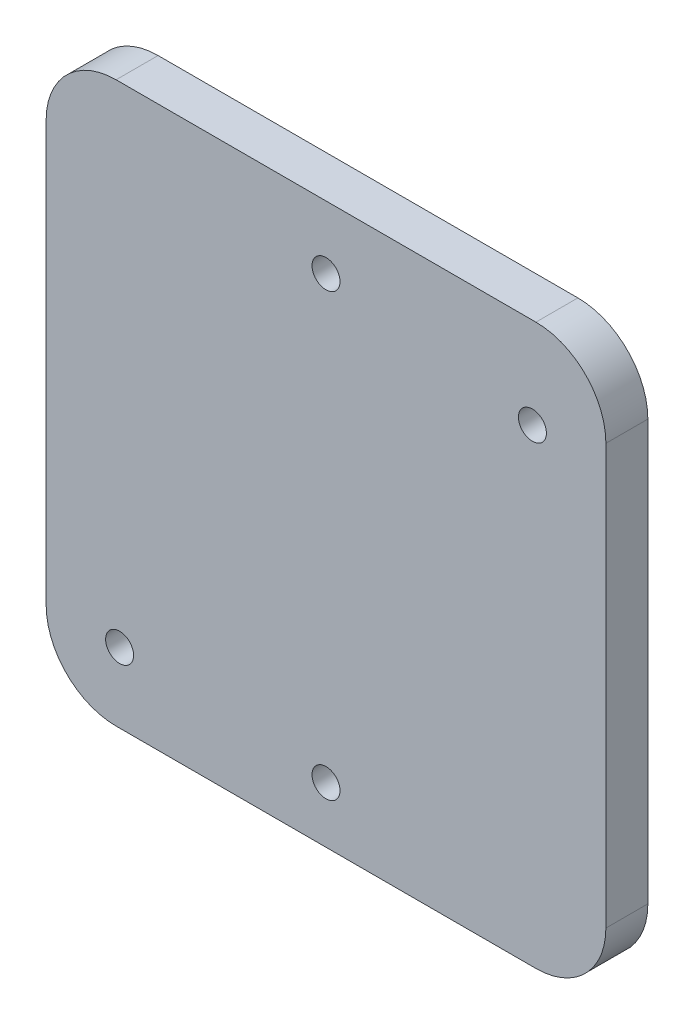
ISO-10303-21;
HEADER;
FILE_DESCRIPTION(('STEP AP214'),'2;1');
FILE_NAME('part.step','',(''),(''),'','','');
FILE_SCHEMA(('AUTOMOTIVE_DESIGN { 1 0 10303 214 1 1 1 1 }'));
ENDSEC;
DATA;
#1=APPLICATION_CONTEXT('core data for automotive mechanical design processes');
#2=APPLICATION_PROTOCOL_DEFINITION('international standard','automotive_design',2000,#1);
#3=PRODUCT_CONTEXT('',#1,'mechanical');
#4=PRODUCT('Part','Part','',(#3));
#5=PRODUCT_RELATED_PRODUCT_CATEGORY('part','',(#4));
#6=PRODUCT_DEFINITION_FORMATION('','',#4);
#7=PRODUCT_DEFINITION_CONTEXT('part definition',#1,'design');
#8=PRODUCT_DEFINITION('design','',#6,#7);
#9=PRODUCT_DEFINITION_SHAPE('','',#8);
#10=(LENGTH_UNIT() NAMED_UNIT(*) SI_UNIT(.MILLI.,.METRE.));
#11=(NAMED_UNIT(*) PLANE_ANGLE_UNIT() SI_UNIT($,.RADIAN.));
#12=(NAMED_UNIT(*) SI_UNIT($,.STERADIAN.) SOLID_ANGLE_UNIT());
#13=UNCERTAINTY_MEASURE_WITH_UNIT(LENGTH_MEASURE(1.E-05),#10,'distance_accuracy_value','');
#14=(GEOMETRIC_REPRESENTATION_CONTEXT(3) GLOBAL_UNCERTAINTY_ASSIGNED_CONTEXT((#13)) GLOBAL_UNIT_ASSIGNED_CONTEXT((#10,
#11,#12)) REPRESENTATION_CONTEXT('',''));
#15=CARTESIAN_POINT('',(0.,0.,0.));
#16=DIRECTION('',(0.,0.,1.));
#17=DIRECTION('',(1.,0.,0.));
#18=AXIS2_PLACEMENT_3D('',#15,#16,#17);
#19=CARTESIAN_POINT('',(-30.,30.,6.));
#20=DIRECTION('',(0.,0.,-1.));
#21=DIRECTION('',(-1.,0.,0.));
#22=AXIS2_PLACEMENT_3D('',#19,#20,#21);
#23=CYLINDRICAL_SURFACE('',#22,10.);
#24=CARTESIAN_POINT('',(-30.,30.,0.));
#25=DIRECTION('',(0.,0.,1.));
#26=DIRECTION('',(1.,0.,0.));
#27=AXIS2_PLACEMENT_3D('',#24,#25,#26);
#28=CIRCLE('',#27,10.);
#29=CARTESIAN_POINT('',(-30.,40.,0.));
#30=VERTEX_POINT('',#29);
#31=CARTESIAN_POINT('',(-40.,30.,0.));
#32=VERTEX_POINT('',#31);
#33=EDGE_CURVE('E129',#30,#32,#28,.T.);
#34=ORIENTED_EDGE('',*,*,#33,.T.);
#35=DIRECTION('',(0.,0.,-1.));
#36=VECTOR('',#35,1.);
#37=CARTESIAN_POINT('',(-40.,30.,6.));
#38=LINE('',#37,#36);
#39=CARTESIAN_POINT('',(-40.,30.,6.));
#40=VERTEX_POINT('',#39);
#41=EDGE_CURVE('E11',#40,#32,#38,.T.);
#42=ORIENTED_EDGE('',*,*,#41,.F.);
#43=CARTESIAN_POINT('',(-30.,30.,6.));
#44=DIRECTION('',(0.,0.,1.));
#45=DIRECTION('',(1.,0.,0.));
#46=AXIS2_PLACEMENT_3D('',#43,#44,#45);
#47=CIRCLE('',#46,10.);
#48=CARTESIAN_POINT('',(-30.,40.,6.));
#49=VERTEX_POINT('',#48);
#50=EDGE_CURVE('E144',#49,#40,#47,.T.);
#51=ORIENTED_EDGE('',*,*,#50,.F.);
#52=DIRECTION('',(0.,0.,-1.));
#53=VECTOR('',#52,1.);
#54=CARTESIAN_POINT('',(-30.,40.,6.));
#55=LINE('',#54,#53);
#56=EDGE_CURVE('E125',#49,#30,#55,.T.);
#57=ORIENTED_EDGE('',*,*,#56,.T.);
#58=EDGE_LOOP('',(#34,#42,#51,#57));
#59=FACE_BOUND('',#58,.T.);
#60=ADVANCED_FACE('F33',(#59),#23,.T.);
#61=CARTESIAN_POINT('',(-40.,30.,6.));
#62=DIRECTION('',(1.,0.,0.));
#63=DIRECTION('',(0.,0.,-1.));
#64=AXIS2_PLACEMENT_3D('',#61,#62,#63);
#65=PLANE('',#64);
#66=DIRECTION('',(0.,-1.,0.));
#67=VECTOR('',#66,1.);
#68=CARTESIAN_POINT('',(-40.,30.,0.));
#69=LINE('',#68,#67);
#70=CARTESIAN_POINT('',(-40.,-30.,0.));
#71=VERTEX_POINT('',#70);
#72=EDGE_CURVE('E132',#32,#71,#69,.T.);
#73=ORIENTED_EDGE('',*,*,#72,.T.);
#74=DIRECTION('',(0.,0.,-1.));
#75=VECTOR('',#74,1.);
#76=CARTESIAN_POINT('',(-40.,-30.,6.));
#77=LINE('',#76,#75);
#78=CARTESIAN_POINT('',(-40.,-30.,6.));
#79=VERTEX_POINT('',#78);
#80=EDGE_CURVE('E41',#79,#71,#77,.T.);
#81=ORIENTED_EDGE('',*,*,#80,.F.);
#82=DIRECTION('',(0.,-1.,0.));
#83=VECTOR('',#82,1.);
#84=CARTESIAN_POINT('',(-40.,30.,6.));
#85=LINE('',#84,#83);
#86=EDGE_CURVE('E92',#40,#79,#85,.T.);
#87=ORIENTED_EDGE('',*,*,#86,.F.);
#88=ORIENTED_EDGE('',*,*,#41,.T.);
#89=EDGE_LOOP('',(#73,#81,#87,#88));
#90=FACE_BOUND('',#89,.T.);
#91=ADVANCED_FACE('F234',(#90),#65,.F.);
#92=CARTESIAN_POINT('',(-30.,-30.,6.));
#93=DIRECTION('',(0.,0.,-1.));
#94=DIRECTION('',(-1.,0.,0.));
#95=AXIS2_PLACEMENT_3D('',#92,#93,#94);
#96=CYLINDRICAL_SURFACE('',#95,10.);
#97=CARTESIAN_POINT('',(-30.,-30.,0.));
#98=DIRECTION('',(0.,0.,1.));
#99=DIRECTION('',(-1.,0.,0.));
#100=AXIS2_PLACEMENT_3D('',#97,#98,#99);
#101=CIRCLE('',#100,10.);
#102=CARTESIAN_POINT('',(-30.,-40.,0.));
#103=VERTEX_POINT('',#102);
#104=EDGE_CURVE('E135',#71,#103,#101,.T.);
#105=ORIENTED_EDGE('',*,*,#104,.T.);
#106=DIRECTION('',(0.,0.,-1.));
#107=VECTOR('',#106,1.);
#108=CARTESIAN_POINT('',(-30.,-40.,6.));
#109=LINE('',#108,#107);
#110=CARTESIAN_POINT('',(-30.,-40.,6.));
#111=VERTEX_POINT('',#110);
#112=EDGE_CURVE('E151',#111,#103,#109,.T.);
#113=ORIENTED_EDGE('',*,*,#112,.F.);
#114=CARTESIAN_POINT('',(-30.,-30.,6.));
#115=DIRECTION('',(0.,0.,1.));
#116=DIRECTION('',(-1.,0.,0.));
#117=AXIS2_PLACEMENT_3D('',#114,#115,#116);
#118=CIRCLE('',#117,10.);
#119=EDGE_CURVE('E159',#79,#111,#118,.T.);
#120=ORIENTED_EDGE('',*,*,#119,.F.);
#121=ORIENTED_EDGE('',*,*,#80,.T.);
#122=EDGE_LOOP('',(#105,#113,#120,#121));
#123=FACE_BOUND('',#122,.T.);
#124=ADVANCED_FACE('F157',(#123),#96,.T.);
#125=CARTESIAN_POINT('',(-30.,-40.,6.));
#126=DIRECTION('',(0.,1.,0.));
#127=DIRECTION('',(-1.,0.,0.));
#128=AXIS2_PLACEMENT_3D('',#125,#126,#127);
#129=PLANE('',#128);
#130=DIRECTION('',(1.,0.,0.));
#131=VECTOR('',#130,1.);
#132=CARTESIAN_POINT('',(-30.,-40.,0.));
#133=LINE('',#132,#131);
#134=CARTESIAN_POINT('',(30.,-40.,0.));
#135=VERTEX_POINT('',#134);
#136=EDGE_CURVE('E137',#103,#135,#133,.T.);
#137=ORIENTED_EDGE('',*,*,#136,.T.);
#138=DIRECTION('',(0.,0.,-1.));
#139=VECTOR('',#138,1.);
#140=CARTESIAN_POINT('',(30.,-40.,6.));
#141=LINE('',#140,#139);
#142=CARTESIAN_POINT('',(30.,-40.,6.));
#143=VERTEX_POINT('',#142);
#144=EDGE_CURVE('E148',#143,#135,#141,.T.);
#145=ORIENTED_EDGE('',*,*,#144,.F.);
#146=DIRECTION('',(1.,0.,0.));
#147=VECTOR('',#146,1.);
#148=CARTESIAN_POINT('',(-30.,-40.,6.));
#149=LINE('',#148,#147);
#150=EDGE_CURVE('E171',#111,#143,#149,.T.);
#151=ORIENTED_EDGE('',*,*,#150,.F.);
#152=ORIENTED_EDGE('',*,*,#112,.T.);
#153=EDGE_LOOP('',(#137,#145,#151,#152));
#154=FACE_BOUND('',#153,.T.);
#155=ADVANCED_FACE('F167',(#154),#129,.F.);
#156=CARTESIAN_POINT('',(30.,-30.,6.));
#157=DIRECTION('',(0.,0.,-1.));
#158=DIRECTION('',(-1.,0.,0.));
#159=AXIS2_PLACEMENT_3D('',#156,#157,#158);
#160=CYLINDRICAL_SURFACE('',#159,10.);
#161=CARTESIAN_POINT('',(30.,-30.,0.));
#162=DIRECTION('',(0.,0.,1.));
#163=DIRECTION('',(1.,0.,0.));
#164=AXIS2_PLACEMENT_3D('',#161,#162,#163);
#165=CIRCLE('',#164,10.);
#166=CARTESIAN_POINT('',(40.,-30.,0.));
#167=VERTEX_POINT('',#166);
#168=EDGE_CURVE('E139',#135,#167,#165,.T.);
#169=ORIENTED_EDGE('',*,*,#168,.T.);
#170=DIRECTION('',(0.,0.,-1.));
#171=VECTOR('',#170,1.);
#172=CARTESIAN_POINT('',(40.,-30.,6.));
#173=LINE('',#172,#171);
#174=CARTESIAN_POINT('',(40.,-30.,6.));
#175=VERTEX_POINT('',#174);
#176=EDGE_CURVE('E120',#175,#167,#173,.T.);
#177=ORIENTED_EDGE('',*,*,#176,.F.);
#178=CARTESIAN_POINT('',(30.,-30.,6.));
#179=DIRECTION('',(0.,0.,1.));
#180=DIRECTION('',(1.,0.,0.));
#181=AXIS2_PLACEMENT_3D('',#178,#179,#180);
#182=CIRCLE('',#181,10.);
#183=EDGE_CURVE('E111',#143,#175,#182,.T.);
#184=ORIENTED_EDGE('',*,*,#183,.F.);
#185=ORIENTED_EDGE('',*,*,#144,.T.);
#186=EDGE_LOOP('',(#169,#177,#184,#185));
#187=FACE_BOUND('',#186,.T.);
#188=ADVANCED_FACE('F170',(#187),#160,.T.);
#189=CARTESIAN_POINT('',(40.,30.,6.));
#190=DIRECTION('',(-1.,0.,0.));
#191=DIRECTION('',(0.,-1.,0.));
#192=AXIS2_PLACEMENT_3D('',#189,#190,#191);
#193=PLANE('',#192);
#194=DIRECTION('',(0.,1.,0.));
#195=VECTOR('',#194,1.);
#196=CARTESIAN_POINT('',(40.,30.,0.));
#197=LINE('',#196,#195);
#198=CARTESIAN_POINT('',(40.,30.,0.));
#199=VERTEX_POINT('',#198);
#200=EDGE_CURVE('E119',#167,#199,#197,.T.);
#201=ORIENTED_EDGE('',*,*,#200,.T.);
#202=DIRECTION('',(0.,0.,-1.));
#203=VECTOR('',#202,1.);
#204=CARTESIAN_POINT('',(40.,30.,6.));
#205=LINE('',#204,#203);
#206=CARTESIAN_POINT('',(40.,30.,6.));
#207=VERTEX_POINT('',#206);
#208=EDGE_CURVE('E116',#207,#199,#205,.T.);
#209=ORIENTED_EDGE('',*,*,#208,.F.);
#210=DIRECTION('',(0.,1.,0.));
#211=VECTOR('',#210,1.);
#212=CARTESIAN_POINT('',(40.,30.,6.));
#213=LINE('',#212,#211);
#214=EDGE_CURVE('E105',#175,#207,#213,.T.);
#215=ORIENTED_EDGE('',*,*,#214,.F.);
#216=ORIENTED_EDGE('',*,*,#176,.T.);
#217=EDGE_LOOP('',(#201,#209,#215,#216));
#218=FACE_BOUND('',#217,.T.);
#219=ADVANCED_FACE('F117',(#218),#193,.F.);
#220=CARTESIAN_POINT('',(30.,30.,6.));
#221=DIRECTION('',(0.,0.,-1.));
#222=DIRECTION('',(-1.,0.,0.));
#223=AXIS2_PLACEMENT_3D('',#220,#221,#222);
#224=CYLINDRICAL_SURFACE('',#223,10.);
#225=CARTESIAN_POINT('',(30.,30.,0.));
#226=DIRECTION('',(0.,0.,1.));
#227=DIRECTION('',(-1.,0.,0.));
#228=AXIS2_PLACEMENT_3D('',#225,#226,#227);
#229=CIRCLE('',#228,10.);
#230=CARTESIAN_POINT('',(30.,40.,0.));
#231=VERTEX_POINT('',#230);
#232=EDGE_CURVE('E78',#199,#231,#229,.T.);
#233=ORIENTED_EDGE('',*,*,#232,.T.);
#234=DIRECTION('',(0.,0.,-1.));
#235=VECTOR('',#234,1.);
#236=CARTESIAN_POINT('',(30.,40.,6.));
#237=LINE('',#236,#235);
#238=CARTESIAN_POINT('',(30.,40.,6.));
#239=VERTEX_POINT('',#238);
#240=EDGE_CURVE('E121',#239,#231,#237,.T.);
#241=ORIENTED_EDGE('',*,*,#240,.F.);
#242=CARTESIAN_POINT('',(30.,30.,6.));
#243=DIRECTION('',(0.,0.,1.));
#244=DIRECTION('',(-1.,0.,0.));
#245=AXIS2_PLACEMENT_3D('',#242,#243,#244);
#246=CIRCLE('',#245,10.);
#247=EDGE_CURVE('E109',#207,#239,#246,.T.);
#248=ORIENTED_EDGE('',*,*,#247,.F.);
#249=ORIENTED_EDGE('',*,*,#208,.T.);
#250=EDGE_LOOP('',(#233,#241,#248,#249));
#251=FACE_BOUND('',#250,.T.);
#252=ADVANCED_FACE('F123',(#251),#224,.T.);
#253=CARTESIAN_POINT('',(-30.,40.,6.));
#254=DIRECTION('',(0.,-1.,0.));
#255=DIRECTION('',(0.,0.,-1.));
#256=AXIS2_PLACEMENT_3D('',#253,#254,#255);
#257=PLANE('',#256);
#258=DIRECTION('',(-1.,0.,0.));
#259=VECTOR('',#258,1.);
#260=CARTESIAN_POINT('',(-30.,40.,0.));
#261=LINE('',#260,#259);
#262=EDGE_CURVE('E84',#231,#30,#261,.T.);
#263=ORIENTED_EDGE('',*,*,#262,.T.);
#264=ORIENTED_EDGE('',*,*,#56,.F.);
#265=DIRECTION('',(-1.,0.,0.));
#266=VECTOR('',#265,1.);
#267=CARTESIAN_POINT('',(-30.,40.,6.));
#268=LINE('',#267,#266);
#269=EDGE_CURVE('E49',#239,#49,#268,.T.);
#270=ORIENTED_EDGE('',*,*,#269,.F.);
#271=ORIENTED_EDGE('',*,*,#240,.T.);
#272=EDGE_LOOP('',(#263,#264,#270,#271));
#273=FACE_BOUND('',#272,.T.);
#274=ADVANCED_FACE('F212',(#273),#257,.F.);
#275=CARTESIAN_POINT('',(-30.,30.,6.));
#276=DIRECTION('',(0.,0.,1.));
#277=DIRECTION('',(1.,0.,0.));
#278=AXIS2_PLACEMENT_3D('',#275,#276,#277);
#279=PLANE('',#278);
#280=CARTESIAN_POINT('',(-29.5,-30.,6.));
#281=DIRECTION('',(0.,0.,1.));
#282=DIRECTION('',(1.,0.,0.));
#283=AXIS2_PLACEMENT_3D('',#280,#281,#282);
#284=CIRCLE('',#283,2.);
#285=CARTESIAN_POINT('',(-27.5,-30.,6.));
#286=VERTEX_POINT('',#285);
#287=EDGE_CURVE('E195',#286,#286,#284,.T.);
#288=ORIENTED_EDGE('',*,*,#287,.F.);
#289=EDGE_LOOP('',(#288));
#290=FACE_BOUND('',#289,.T.);
#291=CARTESIAN_POINT('',(0.,-32.,6.));
#292=DIRECTION('',(0.,0.,1.));
#293=DIRECTION('',(1.,0.,0.));
#294=AXIS2_PLACEMENT_3D('',#291,#292,#293);
#295=CIRCLE('',#294,2.);
#296=CARTESIAN_POINT('',(2.,-32.,6.));
#297=VERTEX_POINT('',#296);
#298=EDGE_CURVE('E189',#297,#297,#295,.T.);
#299=ORIENTED_EDGE('',*,*,#298,.F.);
#300=EDGE_LOOP('',(#299));
#301=FACE_BOUND('',#300,.T.);
#302=CARTESIAN_POINT('',(29.5,27.,6.));
#303=DIRECTION('',(0.,0.,1.));
#304=DIRECTION('',(1.,0.,0.));
#305=AXIS2_PLACEMENT_3D('',#302,#303,#304);
#306=CIRCLE('',#305,2.);
#307=CARTESIAN_POINT('',(31.5,27.,6.));
#308=VERTEX_POINT('',#307);
#309=EDGE_CURVE('E183',#308,#308,#306,.T.);
#310=ORIENTED_EDGE('',*,*,#309,.F.);
#311=EDGE_LOOP('',(#310));
#312=FACE_BOUND('',#311,.T.);
#313=CARTESIAN_POINT('',(0.,31.,6.));
#314=DIRECTION('',(0.,0.,1.));
#315=DIRECTION('',(1.,0.,0.));
#316=AXIS2_PLACEMENT_3D('',#313,#314,#315);
#317=CIRCLE('',#316,2.);
#318=CARTESIAN_POINT('',(2.,31.,6.));
#319=VERTEX_POINT('',#318);
#320=EDGE_CURVE('E177',#319,#319,#317,.T.);
#321=ORIENTED_EDGE('',*,*,#320,.F.);
#322=EDGE_LOOP('',(#321));
#323=FACE_BOUND('',#322,.T.);
#324=ORIENTED_EDGE('',*,*,#50,.T.);
#325=ORIENTED_EDGE('',*,*,#86,.T.);
#326=ORIENTED_EDGE('',*,*,#119,.T.);
#327=ORIENTED_EDGE('',*,*,#150,.T.);
#328=ORIENTED_EDGE('',*,*,#183,.T.);
#329=ORIENTED_EDGE('',*,*,#214,.T.);
#330=ORIENTED_EDGE('',*,*,#247,.T.);
#331=ORIENTED_EDGE('',*,*,#269,.T.);
#332=EDGE_LOOP('',(#324,#325,#326,#327,#328,#329,#330,#331));
#333=FACE_BOUND('',#332,.T.);
#334=ADVANCED_FACE('F107',(#290,#301,#312,#323,#333),#279,.T.);
#335=CARTESIAN_POINT('',(-30.,30.,0.));
#336=DIRECTION('',(0.,0.,1.));
#337=DIRECTION('',(1.,0.,0.));
#338=AXIS2_PLACEMENT_3D('',#335,#336,#337);
#339=PLANE('',#338);
#340=CARTESIAN_POINT('',(-29.5,-30.,0.));
#341=DIRECTION('',(0.,0.,1.));
#342=DIRECTION('',(1.,0.,0.));
#343=AXIS2_PLACEMENT_3D('',#340,#341,#342);
#344=CIRCLE('',#343,2.);
#345=CARTESIAN_POINT('',(-27.5,-30.,0.));
#346=VERTEX_POINT('',#345);
#347=EDGE_CURVE('E192',#346,#346,#344,.T.);
#348=ORIENTED_EDGE('',*,*,#347,.T.);
#349=EDGE_LOOP('',(#348));
#350=FACE_BOUND('',#349,.T.);
#351=CARTESIAN_POINT('',(0.,-32.,0.));
#352=DIRECTION('',(0.,0.,1.));
#353=DIRECTION('',(1.,0.,0.));
#354=AXIS2_PLACEMENT_3D('',#351,#352,#353);
#355=CIRCLE('',#354,2.);
#356=CARTESIAN_POINT('',(2.,-32.,0.));
#357=VERTEX_POINT('',#356);
#358=EDGE_CURVE('E186',#357,#357,#355,.T.);
#359=ORIENTED_EDGE('',*,*,#358,.T.);
#360=EDGE_LOOP('',(#359));
#361=FACE_BOUND('',#360,.T.);
#362=CARTESIAN_POINT('',(29.5,27.,0.));
#363=DIRECTION('',(0.,0.,1.));
#364=DIRECTION('',(1.,0.,0.));
#365=AXIS2_PLACEMENT_3D('',#362,#363,#364);
#366=CIRCLE('',#365,2.);
#367=CARTESIAN_POINT('',(31.5,27.,0.));
#368=VERTEX_POINT('',#367);
#369=EDGE_CURVE('E180',#368,#368,#366,.T.);
#370=ORIENTED_EDGE('',*,*,#369,.T.);
#371=EDGE_LOOP('',(#370));
#372=FACE_BOUND('',#371,.T.);
#373=CARTESIAN_POINT('',(0.,31.,0.));
#374=DIRECTION('',(0.,0.,1.));
#375=DIRECTION('',(1.,0.,0.));
#376=AXIS2_PLACEMENT_3D('',#373,#374,#375);
#377=CIRCLE('',#376,2.);
#378=CARTESIAN_POINT('',(2.,31.,0.));
#379=VERTEX_POINT('',#378);
#380=EDGE_CURVE('E133',#379,#379,#377,.T.);
#381=ORIENTED_EDGE('',*,*,#380,.T.);
#382=EDGE_LOOP('',(#381));
#383=FACE_BOUND('',#382,.T.);
#384=ORIENTED_EDGE('',*,*,#33,.F.);
#385=ORIENTED_EDGE('',*,*,#262,.F.);
#386=ORIENTED_EDGE('',*,*,#232,.F.);
#387=ORIENTED_EDGE('',*,*,#200,.F.);
#388=ORIENTED_EDGE('',*,*,#168,.F.);
#389=ORIENTED_EDGE('',*,*,#136,.F.);
#390=ORIENTED_EDGE('',*,*,#104,.F.);
#391=ORIENTED_EDGE('',*,*,#72,.F.);
#392=EDGE_LOOP('',(#384,#385,#386,#387,#388,#389,#390,#391));
#393=FACE_BOUND('',#392,.T.);
#394=ADVANCED_FACE('F163',(#350,#361,#372,#383,#393),#339,.F.);
#395=CARTESIAN_POINT('',(0.,31.,0.));
#396=DIRECTION('',(0.,0.,1.));
#397=DIRECTION('',(1.,0.,0.));
#398=AXIS2_PLACEMENT_3D('',#395,#396,#397);
#399=CYLINDRICAL_SURFACE('',#398,2.);
#400=ORIENTED_EDGE('',*,*,#380,.F.);
#401=EDGE_LOOP('',(#400));
#402=FACE_BOUND('',#401,.T.);
#403=ORIENTED_EDGE('',*,*,#320,.T.);
#404=EDGE_LOOP('',(#403));
#405=FACE_BOUND('',#404,.T.);
#406=ADVANCED_FACE('F220',(#402,#405),#399,.F.);
#407=CARTESIAN_POINT('',(29.5,27.,0.));
#408=DIRECTION('',(0.,0.,1.));
#409=DIRECTION('',(1.,0.,0.));
#410=AXIS2_PLACEMENT_3D('',#407,#408,#409);
#411=CYLINDRICAL_SURFACE('',#410,2.);
#412=ORIENTED_EDGE('',*,*,#369,.F.);
#413=EDGE_LOOP('',(#412));
#414=FACE_BOUND('',#413,.T.);
#415=ORIENTED_EDGE('',*,*,#309,.T.);
#416=EDGE_LOOP('',(#415));
#417=FACE_BOUND('',#416,.T.);
#418=ADVANCED_FACE('F222',(#414,#417),#411,.F.);
#419=CARTESIAN_POINT('',(0.,-32.,0.));
#420=DIRECTION('',(0.,0.,1.));
#421=DIRECTION('',(1.,0.,0.));
#422=AXIS2_PLACEMENT_3D('',#419,#420,#421);
#423=CYLINDRICAL_SURFACE('',#422,2.);
#424=ORIENTED_EDGE('',*,*,#358,.F.);
#425=EDGE_LOOP('',(#424));
#426=FACE_BOUND('',#425,.T.);
#427=ORIENTED_EDGE('',*,*,#298,.T.);
#428=EDGE_LOOP('',(#427));
#429=FACE_BOUND('',#428,.T.);
#430=ADVANCED_FACE('F206',(#426,#429),#423,.F.);
#431=CARTESIAN_POINT('',(-29.5,-30.,0.));
#432=DIRECTION('',(0.,0.,1.));
#433=DIRECTION('',(1.,0.,0.));
#434=AXIS2_PLACEMENT_3D('',#431,#432,#433);
#435=CYLINDRICAL_SURFACE('',#434,2.);
#436=ORIENTED_EDGE('',*,*,#347,.F.);
#437=EDGE_LOOP('',(#436));
#438=FACE_BOUND('',#437,.T.);
#439=ORIENTED_EDGE('',*,*,#287,.T.);
#440=EDGE_LOOP('',(#439));
#441=FACE_BOUND('',#440,.T.);
#442=ADVANCED_FACE('F203',(#438,#441),#435,.F.);
#443=CLOSED_SHELL('',(#60,#91,#124,#155,#188,#219,#252,#274,#334,#394,#406,#418,#430,#442));
#444=MANIFOLD_SOLID_BREP('B2',#443);
#445=ADVANCED_BREP_SHAPE_REPRESENTATION('',(#18,#444),#14);
#446=SHAPE_DEFINITION_REPRESENTATION(#9,#445);
ENDSEC;
END-ISO-10303-21;
